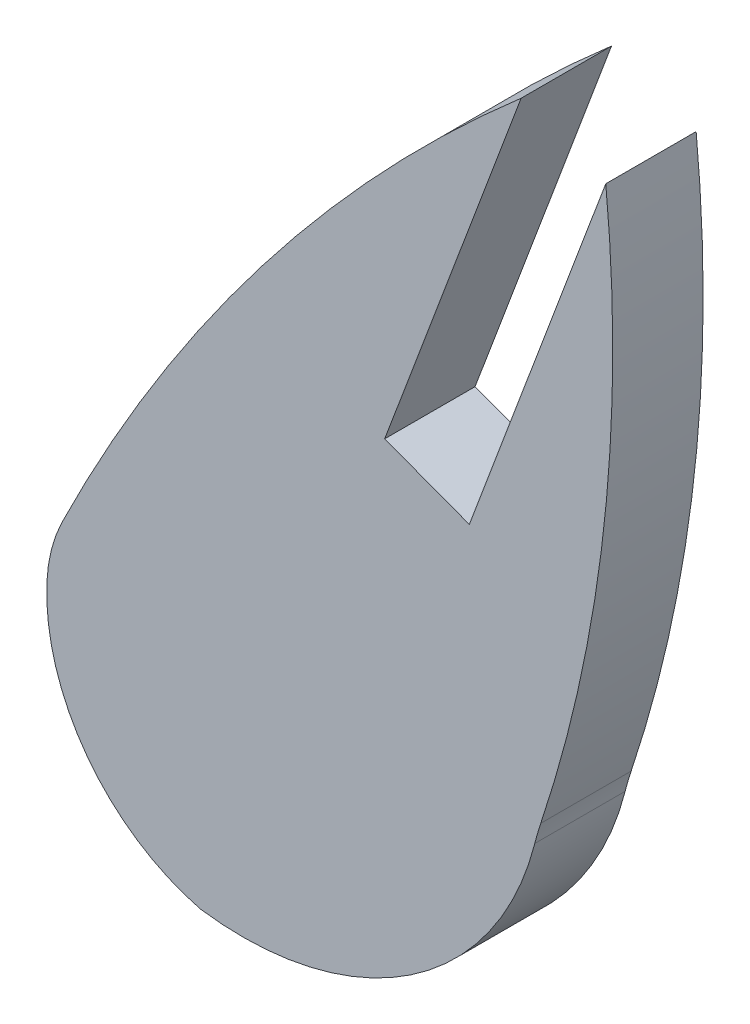
ISO-10303-21;
HEADER;
FILE_DESCRIPTION(('STEP AP214'),'2;1');
FILE_NAME('part.step','',(''),(''),'','','');
FILE_SCHEMA(('AUTOMOTIVE_DESIGN { 1 0 10303 214 1 1 1 1 }'));
ENDSEC;
DATA;
#1=APPLICATION_CONTEXT('core data for automotive mechanical design processes');
#2=APPLICATION_PROTOCOL_DEFINITION('international standard','automotive_design',2000,#1);
#3=PRODUCT_CONTEXT('',#1,'mechanical');
#4=PRODUCT('Part','Part','',(#3));
#5=PRODUCT_RELATED_PRODUCT_CATEGORY('part','',(#4));
#6=PRODUCT_DEFINITION_FORMATION('','',#4);
#7=PRODUCT_DEFINITION_CONTEXT('part definition',#1,'design');
#8=PRODUCT_DEFINITION('design','',#6,#7);
#9=PRODUCT_DEFINITION_SHAPE('','',#8);
#10=(LENGTH_UNIT() NAMED_UNIT(*) SI_UNIT(.MILLI.,.METRE.));
#11=(NAMED_UNIT(*) PLANE_ANGLE_UNIT() SI_UNIT($,.RADIAN.));
#12=(NAMED_UNIT(*) SI_UNIT($,.STERADIAN.) SOLID_ANGLE_UNIT());
#13=UNCERTAINTY_MEASURE_WITH_UNIT(LENGTH_MEASURE(1.E-05),#10,'distance_accuracy_value','');
#14=(GEOMETRIC_REPRESENTATION_CONTEXT(3) GLOBAL_UNCERTAINTY_ASSIGNED_CONTEXT((#13)) GLOBAL_UNIT_ASSIGNED_CONTEXT((#10,
#11,#12)) REPRESENTATION_CONTEXT('',''));
#15=CARTESIAN_POINT('',(0.,0.,0.));
#16=DIRECTION('',(0.,0.,1.));
#17=DIRECTION('',(1.,0.,0.));
#18=AXIS2_PLACEMENT_3D('',#15,#16,#17);
#19=CARTESIAN_POINT('',(-881.660993393996,-92.339258861489,3.));
#20=DIRECTION('',(0.,0.,-1.));
#21=DIRECTION('',(-1.,0.,0.));
#22=AXIS2_PLACEMENT_3D('',#19,#20,#21);
#23=CYLINDRICAL_SURFACE('',#22,47.0579792938459);
#24=CARTESIAN_POINT('',(-881.660993393996,-92.339258861489,0.));
#25=DIRECTION('',(0.,0.,1.));
#26=DIRECTION('',(1.,0.,0.));
#27=AXIS2_PLACEMENT_3D('',#24,#25,#26);
#28=CIRCLE('',#27,47.0579792938459);
#29=CARTESIAN_POINT('',(-836.992003912058,-107.142461011107,0.));
#30=VERTEX_POINT('',#29);
#31=CARTESIAN_POINT('',(-834.834343420026,-87.67897266477,0.));
#32=VERTEX_POINT('',#31);
#33=EDGE_CURVE('E106',#30,#32,#28,.T.);
#34=ORIENTED_EDGE('',*,*,#33,.T.);
#35=DIRECTION('',(0.,0.,-1.));
#36=VECTOR('',#35,1.);
#37=CARTESIAN_POINT('',(-834.834343420026,-87.67897266477,3.));
#38=LINE('',#37,#36);
#39=CARTESIAN_POINT('',(-834.834343420026,-87.67897266477,3.));
#40=VERTEX_POINT('',#39);
#41=EDGE_CURVE('E11',#40,#32,#38,.T.);
#42=ORIENTED_EDGE('',*,*,#41,.F.);
#43=CARTESIAN_POINT('',(-881.660993393996,-92.339258861489,3.));
#44=DIRECTION('',(0.,0.,1.));
#45=DIRECTION('',(1.,0.,0.));
#46=AXIS2_PLACEMENT_3D('',#43,#44,#45);
#47=CIRCLE('',#46,47.0579792938459);
#48=CARTESIAN_POINT('',(-836.992003912058,-107.142461011107,3.));
#49=VERTEX_POINT('',#48);
#50=EDGE_CURVE('E135',#49,#40,#47,.T.);
#51=ORIENTED_EDGE('',*,*,#50,.F.);
#52=DIRECTION('',(0.,0.,-1.));
#53=VECTOR('',#52,1.);
#54=CARTESIAN_POINT('',(-836.992003912058,-107.142461011107,3.));
#55=LINE('',#54,#53);
#56=EDGE_CURVE('E119',#49,#30,#55,.T.);
#57=ORIENTED_EDGE('',*,*,#56,.T.);
#58=EDGE_LOOP('',(#34,#42,#51,#57));
#59=FACE_BOUND('',#58,.T.);
#60=ADVANCED_FACE('F32',(#59),#23,.T.);
#61=CARTESIAN_POINT('',(-834.834343420026,-87.67897266477,3.));
#62=DIRECTION('',(0.936112926246517,-0.35169957252488,0.));
#63=DIRECTION('',(0.35169957252488,0.936112926246517,0.));
#64=AXIS2_PLACEMENT_3D('',#61,#62,#63);
#65=PLANE('',#64);
#66=DIRECTION('',(-0.35169957252488,-0.936112926246517,0.));
#67=VECTOR('',#66,1.);
#68=CARTESIAN_POINT('',(-834.834343420026,-87.67897266477,0.));
#69=LINE('',#68,#67);
#70=CARTESIAN_POINT('',(-839.364460389175,-99.7367099596548,0.));
#71=VERTEX_POINT('',#70);
#72=EDGE_CURVE('E102',#32,#71,#69,.T.);
#73=ORIENTED_EDGE('',*,*,#72,.T.);
#74=DIRECTION('',(0.,0.,-1.));
#75=VECTOR('',#74,1.);
#76=CARTESIAN_POINT('',(-839.364460389175,-99.7367099596548,3.));
#77=LINE('',#76,#75);
#78=CARTESIAN_POINT('',(-839.364460389175,-99.7367099596548,3.));
#79=VERTEX_POINT('',#78);
#80=EDGE_CURVE('E39',#79,#71,#77,.T.);
#81=ORIENTED_EDGE('',*,*,#80,.F.);
#82=DIRECTION('',(-0.35169957252488,-0.936112926246517,0.));
#83=VECTOR('',#82,1.);
#84=CARTESIAN_POINT('',(-834.834343420026,-87.67897266477,3.));
#85=LINE('',#84,#83);
#86=EDGE_CURVE('E115',#40,#79,#85,.T.);
#87=ORIENTED_EDGE('',*,*,#86,.F.);
#88=ORIENTED_EDGE('',*,*,#41,.T.);
#89=EDGE_LOOP('',(#73,#81,#87,#88));
#90=FACE_BOUND('',#89,.T.);
#91=ADVANCED_FACE('F114',(#90),#65,.F.);
#92=CARTESIAN_POINT('',(-839.364460389175,-99.7367099596548,3.));
#93=DIRECTION('',(-0.351699572524882,-0.936112926246516,0.));
#94=DIRECTION('',(0.936112926246516,-0.351699572524882,0.));
#95=AXIS2_PLACEMENT_3D('',#92,#93,#94);
#96=PLANE('',#95);
#97=DIRECTION('',(-0.936112926246516,0.351699572524882,0.));
#98=VECTOR('',#97,1.);
#99=CARTESIAN_POINT('',(-839.364460389175,-99.7367099596548,0.));
#100=LINE('',#99,#98);
#101=CARTESIAN_POINT('',(-842.172799167914,-98.6816112420802,0.));
#102=VERTEX_POINT('',#101);
#103=EDGE_CURVE('E108',#71,#102,#100,.T.);
#104=ORIENTED_EDGE('',*,*,#103,.T.);
#105=DIRECTION('',(0.,0.,-1.));
#106=VECTOR('',#105,1.);
#107=CARTESIAN_POINT('',(-842.172799167914,-98.6816112420802,3.));
#108=LINE('',#107,#106);
#109=CARTESIAN_POINT('',(-842.172799167914,-98.6816112420802,3.));
#110=VERTEX_POINT('',#109);
#111=EDGE_CURVE('E166',#110,#102,#108,.T.);
#112=ORIENTED_EDGE('',*,*,#111,.F.);
#113=DIRECTION('',(-0.936112926246516,0.351699572524882,0.));
#114=VECTOR('',#113,1.);
#115=CARTESIAN_POINT('',(-839.364460389175,-99.7367099596548,3.));
#116=LINE('',#115,#114);
#117=EDGE_CURVE('E138',#79,#110,#116,.T.);
#118=ORIENTED_EDGE('',*,*,#117,.F.);
#119=ORIENTED_EDGE('',*,*,#80,.T.);
#120=EDGE_LOOP('',(#104,#112,#118,#119));
#121=FACE_BOUND('',#120,.T.);
#122=ADVANCED_FACE('F170',(#121),#96,.F.);
#123=CARTESIAN_POINT('',(-842.172799167914,-98.6816112420802,3.));
#124=DIRECTION('',(-0.936112926246517,0.351699572524881,0.));
#125=DIRECTION('',(-0.351699572524881,-0.936112926246517,0.));
#126=AXIS2_PLACEMENT_3D('',#123,#124,#125);
#127=PLANE('',#126);
#128=DIRECTION('',(0.351699572524881,0.936112926246517,0.));
#129=VECTOR('',#128,1.);
#130=CARTESIAN_POINT('',(-842.172799167914,-98.6816112420802,0.));
#131=LINE('',#130,#129);
#132=CARTESIAN_POINT('',(-837.642682198766,-86.6238739471953,0.));
#133=VERTEX_POINT('',#132);
#134=EDGE_CURVE('E123',#102,#133,#131,.T.);
#135=ORIENTED_EDGE('',*,*,#134,.T.);
#136=DIRECTION('',(0.,0.,-1.));
#137=VECTOR('',#136,1.);
#138=CARTESIAN_POINT('',(-837.642682198766,-86.6238739471953,3.));
#139=LINE('',#138,#137);
#140=CARTESIAN_POINT('',(-837.642682198766,-86.6238739471953,3.));
#141=VERTEX_POINT('',#140);
#142=EDGE_CURVE('E163',#141,#133,#139,.T.);
#143=ORIENTED_EDGE('',*,*,#142,.F.);
#144=DIRECTION('',(0.351699572524881,0.936112926246517,0.));
#145=VECTOR('',#144,1.);
#146=CARTESIAN_POINT('',(-842.172799167914,-98.6816112420802,3.));
#147=LINE('',#146,#145);
#148=EDGE_CURVE('E140',#110,#141,#147,.T.);
#149=ORIENTED_EDGE('',*,*,#148,.F.);
#150=ORIENTED_EDGE('',*,*,#111,.T.);
#151=EDGE_LOOP('',(#135,#143,#149,#150));
#152=FACE_BOUND('',#151,.T.);
#153=ADVANCED_FACE('F178',(#152),#127,.F.);
#154=CARTESIAN_POINT('',(-796.449004153568,-134.082653367293,3.));
#155=DIRECTION('',(0.,0.,-1.));
#156=DIRECTION('',(-1.,0.,0.));
#157=AXIS2_PLACEMENT_3D('',#154,#155,#156);
#158=CYLINDRICAL_SURFACE('',#157,62.8430971144558);
#159=CARTESIAN_POINT('',(-796.449004153568,-134.082653367293,0.));
#160=DIRECTION('',(0.,0.,1.));
#161=DIRECTION('',(-1.,0.,0.));
#162=AXIS2_PLACEMENT_3D('',#159,#160,#161);
#163=CIRCLE('',#162,62.8430971144558);
#164=CARTESIAN_POINT('',(-852.880224120933,-106.428137136995,0.));
#165=VERTEX_POINT('',#164);
#166=EDGE_CURVE('E125',#133,#165,#163,.T.);
#167=ORIENTED_EDGE('',*,*,#166,.T.);
#168=DIRECTION('',(0.,0.,-1.));
#169=VECTOR('',#168,1.);
#170=CARTESIAN_POINT('',(-852.880224120933,-106.428137136995,3.));
#171=LINE('',#170,#169);
#172=CARTESIAN_POINT('',(-852.880224120933,-106.428137136995,3.));
#173=VERTEX_POINT('',#172);
#174=EDGE_CURVE('E160',#173,#165,#171,.T.);
#175=ORIENTED_EDGE('',*,*,#174,.F.);
#176=CARTESIAN_POINT('',(-796.449004153568,-134.082653367293,3.));
#177=DIRECTION('',(0.,0.,1.));
#178=DIRECTION('',(-1.,0.,0.));
#179=AXIS2_PLACEMENT_3D('',#176,#177,#178);
#180=CIRCLE('',#179,62.8430971144558);
#181=EDGE_CURVE('E142',#141,#173,#180,.T.);
#182=ORIENTED_EDGE('',*,*,#181,.F.);
#183=ORIENTED_EDGE('',*,*,#142,.T.);
#184=EDGE_LOOP('',(#167,#175,#182,#183));
#185=FACE_BOUND('',#184,.T.);
#186=ADVANCED_FACE('F181',(#185),#158,.T.);
#187=CARTESIAN_POINT('',(-848.390373798583,-108.62841986494,3.));
#188=DIRECTION('',(0.,0.,-1.));
#189=DIRECTION('',(-1.,0.,0.));
#190=AXIS2_PLACEMENT_3D('',#187,#188,#189);
#191=CYLINDRICAL_SURFACE('',#190,5.00000000000023);
#192=CARTESIAN_POINT('',(-848.390373798583,-108.62841986494,0.));
#193=DIRECTION('',(0.,0.,1.));
#194=DIRECTION('',(-1.,0.,0.));
#195=AXIS2_PLACEMENT_3D('',#192,#193,#194);
#196=CIRCLE('',#195,5.00000000000023);
#197=CARTESIAN_POINT('',(-853.386054738141,-108.420641256476,0.));
#198=VERTEX_POINT('',#197);
#199=EDGE_CURVE('E127',#165,#198,#196,.T.);
#200=ORIENTED_EDGE('',*,*,#199,.T.);
#201=DIRECTION('',(0.,0.,-1.));
#202=VECTOR('',#201,1.);
#203=CARTESIAN_POINT('',(-853.386054738141,-108.420641256476,3.));
#204=LINE('',#203,#202);
#205=CARTESIAN_POINT('',(-853.386054738141,-108.420641256476,3.));
#206=VERTEX_POINT('',#205);
#207=EDGE_CURVE('E157',#206,#198,#204,.T.);
#208=ORIENTED_EDGE('',*,*,#207,.F.);
#209=CARTESIAN_POINT('',(-848.390373798583,-108.62841986494,3.));
#210=DIRECTION('',(0.,0.,1.));
#211=DIRECTION('',(-1.,0.,0.));
#212=AXIS2_PLACEMENT_3D('',#209,#210,#211);
#213=CIRCLE('',#212,5.00000000000023);
#214=EDGE_CURVE('E144',#173,#206,#213,.T.);
#215=ORIENTED_EDGE('',*,*,#214,.F.);
#216=ORIENTED_EDGE('',*,*,#174,.T.);
#217=EDGE_LOOP('',(#200,#208,#215,#216));
#218=FACE_BOUND('',#217,.T.);
#219=ADVANCED_FACE('F186',(#218),#191,.T.);
#220=CARTESIAN_POINT('',(-846.630209496511,-108.701628000883,3.));
#221=DIRECTION('',(0.,0.,-1.));
#222=DIRECTION('',(-1.,0.,0.));
#223=AXIS2_PLACEMENT_3D('',#220,#221,#222);
#224=CYLINDRICAL_SURFACE('',#223,6.76168606779278);
#225=CARTESIAN_POINT('',(-846.630209496511,-108.701628000883,0.));
#226=DIRECTION('',(0.,0.,1.));
#227=DIRECTION('',(-1.,0.,0.));
#228=AXIS2_PLACEMENT_3D('',#225,#226,#227);
#229=CIRCLE('',#228,6.76168606779278);
#230=CARTESIAN_POINT('',(-848.28149683297,-115.258582218493,0.));
#231=VERTEX_POINT('',#230);
#232=EDGE_CURVE('E129',#198,#231,#229,.T.);
#233=ORIENTED_EDGE('',*,*,#232,.T.);
#234=DIRECTION('',(0.,0.,-1.));
#235=VECTOR('',#234,1.);
#236=CARTESIAN_POINT('',(-848.28149683297,-115.258582218493,3.));
#237=LINE('',#236,#235);
#238=CARTESIAN_POINT('',(-848.28149683297,-115.258582218493,3.));
#239=VERTEX_POINT('',#238);
#240=EDGE_CURVE('E154',#239,#231,#237,.T.);
#241=ORIENTED_EDGE('',*,*,#240,.F.);
#242=CARTESIAN_POINT('',(-846.630209496511,-108.701628000883,3.));
#243=DIRECTION('',(0.,0.,1.));
#244=DIRECTION('',(-1.,0.,0.));
#245=AXIS2_PLACEMENT_3D('',#242,#243,#244);
#246=CIRCLE('',#245,6.76168606779278);
#247=EDGE_CURVE('E146',#206,#239,#246,.T.);
#248=ORIENTED_EDGE('',*,*,#247,.F.);
#249=ORIENTED_EDGE('',*,*,#207,.T.);
#250=EDGE_LOOP('',(#233,#241,#248,#249));
#251=FACE_BOUND('',#250,.T.);
#252=ADVANCED_FACE('F190',(#251),#224,.T.);
#253=CARTESIAN_POINT('',(-846.882215697184,-105.35696556751,3.));
#254=DIRECTION('',(0.,0.,-1.));
#255=DIRECTION('',(-1.,0.,0.));
#256=AXIS2_PLACEMENT_3D('',#253,#254,#255);
#257=CYLINDRICAL_SURFACE('',#256,9.99999999999997);
#258=CARTESIAN_POINT('',(-846.882215697184,-105.35696556751,0.));
#259=DIRECTION('',(0.,0.,1.));
#260=DIRECTION('',(1.,0.,0.));
#261=AXIS2_PLACEMENT_3D('',#258,#259,#260);
#262=CIRCLE('',#261,9.99999999999997);
#263=CARTESIAN_POINT('',(-837.190944525932,-107.822581734974,0.));
#264=VERTEX_POINT('',#263);
#265=EDGE_CURVE('E131',#231,#264,#262,.T.);
#266=ORIENTED_EDGE('',*,*,#265,.T.);
#267=DIRECTION('',(0.,0.,-1.));
#268=VECTOR('',#267,1.);
#269=CARTESIAN_POINT('',(-837.190944525932,-107.822581734974,3.));
#270=LINE('',#269,#268);
#271=CARTESIAN_POINT('',(-837.190944525932,-107.822581734974,3.));
#272=VERTEX_POINT('',#271);
#273=EDGE_CURVE('E151',#272,#264,#270,.T.);
#274=ORIENTED_EDGE('',*,*,#273,.F.);
#275=CARTESIAN_POINT('',(-846.882215697184,-105.35696556751,3.));
#276=DIRECTION('',(0.,0.,1.));
#277=DIRECTION('',(1.,0.,0.));
#278=AXIS2_PLACEMENT_3D('',#275,#276,#277);
#279=CIRCLE('',#278,9.99999999999997);
#280=EDGE_CURVE('E51',#239,#272,#279,.T.);
#281=ORIENTED_EDGE('',*,*,#280,.F.);
#282=ORIENTED_EDGE('',*,*,#240,.T.);
#283=EDGE_LOOP('',(#266,#274,#281,#282));
#284=FACE_BOUND('',#283,.T.);
#285=ADVANCED_FACE('F194',(#284),#257,.T.);
#286=CARTESIAN_POINT('',(-827.49967335468,-110.288197902439,3.));
#287=DIRECTION('',(0.,0.,-1.));
#288=DIRECTION('',(-1.,0.,0.));
#289=AXIS2_PLACEMENT_3D('',#286,#287,#288);
#290=CYLINDRICAL_SURFACE('',#289,10.0000000000001);
#291=CARTESIAN_POINT('',(-827.49967335468,-110.288197902439,0.));
#292=DIRECTION('',(0.,0.,-1.));
#293=DIRECTION('',(1.,0.,0.));
#294=AXIS2_PLACEMENT_3D('',#291,#292,#293);
#295=CIRCLE('',#294,10.0000000000001);
#296=EDGE_CURVE('E133',#264,#30,#295,.T.);
#297=ORIENTED_EDGE('',*,*,#296,.T.);
#298=ORIENTED_EDGE('',*,*,#56,.F.);
#299=CARTESIAN_POINT('',(-827.49967335468,-110.288197902439,3.));
#300=DIRECTION('',(0.,0.,-1.));
#301=DIRECTION('',(1.,0.,0.));
#302=AXIS2_PLACEMENT_3D('',#299,#300,#301);
#303=CIRCLE('',#302,10.0000000000001);
#304=EDGE_CURVE('E46',#272,#49,#303,.T.);
#305=ORIENTED_EDGE('',*,*,#304,.F.);
#306=ORIENTED_EDGE('',*,*,#273,.T.);
#307=EDGE_LOOP('',(#297,#298,#305,#306));
#308=FACE_BOUND('',#307,.T.);
#309=ADVANCED_FACE('F196',(#308),#290,.F.);
#310=CARTESIAN_POINT('',(-881.660993393996,-92.339258861489,3.));
#311=DIRECTION('',(0.,0.,1.));
#312=DIRECTION('',(1.,0.,0.));
#313=AXIS2_PLACEMENT_3D('',#310,#311,#312);
#314=PLANE('',#313);
#315=ORIENTED_EDGE('',*,*,#50,.T.);
#316=ORIENTED_EDGE('',*,*,#86,.T.);
#317=ORIENTED_EDGE('',*,*,#117,.T.);
#318=ORIENTED_EDGE('',*,*,#148,.T.);
#319=ORIENTED_EDGE('',*,*,#181,.T.);
#320=ORIENTED_EDGE('',*,*,#214,.T.);
#321=ORIENTED_EDGE('',*,*,#247,.T.);
#322=ORIENTED_EDGE('',*,*,#280,.T.);
#323=ORIENTED_EDGE('',*,*,#304,.T.);
#324=EDGE_LOOP('',(#315,#316,#317,#318,#319,#320,#321,#322,#323));
#325=FACE_BOUND('',#324,.T.);
#326=ADVANCED_FACE('F173',(#325),#314,.T.);
#327=CARTESIAN_POINT('',(-881.660993393996,-92.339258861489,0.));
#328=DIRECTION('',(0.,0.,1.));
#329=DIRECTION('',(1.,0.,0.));
#330=AXIS2_PLACEMENT_3D('',#327,#328,#329);
#331=PLANE('',#330);
#332=ORIENTED_EDGE('',*,*,#33,.F.);
#333=ORIENTED_EDGE('',*,*,#296,.F.);
#334=ORIENTED_EDGE('',*,*,#265,.F.);
#335=ORIENTED_EDGE('',*,*,#232,.F.);
#336=ORIENTED_EDGE('',*,*,#199,.F.);
#337=ORIENTED_EDGE('',*,*,#166,.F.);
#338=ORIENTED_EDGE('',*,*,#134,.F.);
#339=ORIENTED_EDGE('',*,*,#103,.F.);
#340=ORIENTED_EDGE('',*,*,#72,.F.);
#341=EDGE_LOOP('',(#332,#333,#334,#335,#336,#337,#338,#339,#340));
#342=FACE_BOUND('',#341,.T.);
#343=ADVANCED_FACE('F103',(#342),#331,.F.);
#344=CLOSED_SHELL('',(#60,#91,#122,#153,#186,#219,#252,#285,#309,#326,#343));
#345=MANIFOLD_SOLID_BREP('B2',#344);
#346=ADVANCED_BREP_SHAPE_REPRESENTATION('',(#18,#345),#14);
#347=SHAPE_DEFINITION_REPRESENTATION(#9,#346);
ENDSEC;
END-ISO-10303-21;
